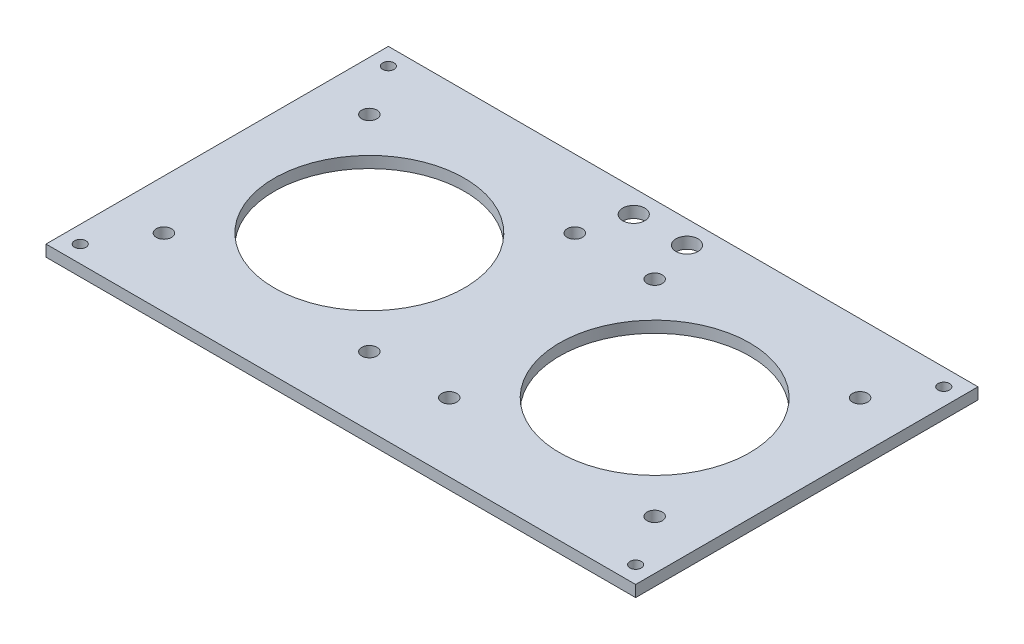
ISO-10303-21;
HEADER;
FILE_DESCRIPTION(('STEP AP214'),'2;1');
FILE_NAME('part.step','',(''),(''),'','','');
FILE_SCHEMA(('AUTOMOTIVE_DESIGN { 1 0 10303 214 1 1 1 1 }'));
ENDSEC;
DATA;
#1=APPLICATION_CONTEXT('core data for automotive mechanical design processes');
#2=APPLICATION_PROTOCOL_DEFINITION('international standard','automotive_design',2000,#1);
#3=PRODUCT_CONTEXT('',#1,'mechanical');
#4=PRODUCT('Part','Part','',(#3));
#5=PRODUCT_RELATED_PRODUCT_CATEGORY('part','',(#4));
#6=PRODUCT_DEFINITION_FORMATION('','',#4);
#7=PRODUCT_DEFINITION_CONTEXT('part definition',#1,'design');
#8=PRODUCT_DEFINITION('design','',#6,#7);
#9=PRODUCT_DEFINITION_SHAPE('','',#8);
#10=(LENGTH_UNIT() NAMED_UNIT(*) SI_UNIT(.MILLI.,.METRE.));
#11=(NAMED_UNIT(*) PLANE_ANGLE_UNIT() SI_UNIT($,.RADIAN.));
#12=(NAMED_UNIT(*) SI_UNIT($,.STERADIAN.) SOLID_ANGLE_UNIT());
#13=UNCERTAINTY_MEASURE_WITH_UNIT(LENGTH_MEASURE(1.E-05),#10,'distance_accuracy_value','');
#14=(GEOMETRIC_REPRESENTATION_CONTEXT(3) GLOBAL_UNCERTAINTY_ASSIGNED_CONTEXT((#13)) GLOBAL_UNIT_ASSIGNED_CONTEXT((#10,
#11,#12)) REPRESENTATION_CONTEXT('',''));
#15=CARTESIAN_POINT('',(0.,0.,0.));
#16=DIRECTION('',(0.,0.,1.));
#17=DIRECTION('',(1.,0.,0.));
#18=AXIS2_PLACEMENT_3D('',#15,#16,#17);
#19=CARTESIAN_POINT('',(0.,3.,0.));
#20=DIRECTION('',(0.,-1.,0.));
#21=DIRECTION('',(0.,0.,-1.));
#22=AXIS2_PLACEMENT_3D('',#19,#20,#21);
#23=PLANE('',#22);
#24=DIRECTION('',(0.,0.,-1.));
#25=VECTOR('',#24,1.);
#26=CARTESIAN_POINT('',(77.5,3.,45.));
#27=LINE('',#26,#25);
#28=CARTESIAN_POINT('',(77.5,3.,45.));
#29=VERTEX_POINT('',#28);
#30=CARTESIAN_POINT('',(77.5,3.,-45.));
#31=VERTEX_POINT('',#30);
#32=EDGE_CURVE('E91',#29,#31,#27,.T.);
#33=ORIENTED_EDGE('',*,*,#32,.T.);
#34=DIRECTION('',(-1.,0.,0.));
#35=VECTOR('',#34,1.);
#36=CARTESIAN_POINT('',(-77.5,3.,-45.));
#37=LINE('',#36,#35);
#38=CARTESIAN_POINT('',(-77.5,3.,-45.));
#39=VERTEX_POINT('',#38);
#40=EDGE_CURVE('E86',#31,#39,#37,.T.);
#41=ORIENTED_EDGE('',*,*,#40,.T.);
#42=DIRECTION('',(0.,0.,1.));
#43=VECTOR('',#42,1.);
#44=CARTESIAN_POINT('',(-77.5,3.,45.));
#45=LINE('',#44,#43);
#46=CARTESIAN_POINT('',(-77.5,3.,45.));
#47=VERTEX_POINT('',#46);
#48=EDGE_CURVE('E89',#39,#47,#45,.T.);
#49=ORIENTED_EDGE('',*,*,#48,.T.);
#50=DIRECTION('',(1.,0.,0.));
#51=VECTOR('',#50,1.);
#52=CARTESIAN_POINT('',(-77.5,3.,45.));
#53=LINE('',#52,#51);
#54=EDGE_CURVE('E56',#47,#29,#53,.T.);
#55=ORIENTED_EDGE('',*,*,#54,.T.);
#56=EDGE_LOOP('',(#33,#41,#49,#55));
#57=FACE_BOUND('',#56,.T.);
#58=CARTESIAN_POINT('',(-37.5,3.,0.));
#59=DIRECTION('',(0.,1.,0.));
#60=DIRECTION('',(0.,0.,1.));
#61=AXIS2_PLACEMENT_3D('',#58,#59,#60);
#62=CIRCLE('',#61,25.);
#63=CARTESIAN_POINT('',(-37.5,3.,25.));
#64=VERTEX_POINT('',#63);
#65=EDGE_CURVE('E106',#64,#64,#62,.T.);
#66=ORIENTED_EDGE('',*,*,#65,.F.);
#67=EDGE_LOOP('',(#66));
#68=FACE_BOUND('',#67,.T.);
#69=CARTESIAN_POINT('',(-64.5,3.,-27.));
#70=DIRECTION('',(0.,1.,0.));
#71=DIRECTION('',(0.,0.,1.));
#72=AXIS2_PLACEMENT_3D('',#69,#70,#71);
#73=CIRCLE('',#72,2.);
#74=CARTESIAN_POINT('',(-64.5,3.,-25.));
#75=VERTEX_POINT('',#74);
#76=EDGE_CURVE('E121',#75,#75,#73,.T.);
#77=ORIENTED_EDGE('',*,*,#76,.F.);
#78=EDGE_LOOP('',(#77));
#79=FACE_BOUND('',#78,.T.);
#80=CARTESIAN_POINT('',(-10.5,3.,-27.));
#81=DIRECTION('',(0.,1.,0.));
#82=DIRECTION('',(0.,0.,-1.));
#83=AXIS2_PLACEMENT_3D('',#80,#81,#82);
#84=CIRCLE('',#83,2.);
#85=CARTESIAN_POINT('',(-10.5,3.,-29.));
#86=VERTEX_POINT('',#85);
#87=EDGE_CURVE('E127',#86,#86,#84,.T.);
#88=ORIENTED_EDGE('',*,*,#87,.F.);
#89=EDGE_LOOP('',(#88));
#90=FACE_BOUND('',#89,.T.);
#91=CARTESIAN_POINT('',(10.5000000000001,3.,27.));
#92=DIRECTION('',(0.,1.,0.));
#93=DIRECTION('',(0.,0.,-1.));
#94=AXIS2_PLACEMENT_3D('',#91,#92,#93);
#95=CIRCLE('',#94,2.);
#96=CARTESIAN_POINT('',(10.5000000000001,3.,25.));
#97=VERTEX_POINT('',#96);
#98=EDGE_CURVE('E133',#97,#97,#95,.T.);
#99=ORIENTED_EDGE('',*,*,#98,.F.);
#100=EDGE_LOOP('',(#99));
#101=FACE_BOUND('',#100,.T.);
#102=CARTESIAN_POINT('',(-10.5,3.,27.));
#103=DIRECTION('',(0.,1.,0.));
#104=DIRECTION('',(0.,0.,1.));
#105=AXIS2_PLACEMENT_3D('',#102,#103,#104);
#106=CIRCLE('',#105,2.);
#107=CARTESIAN_POINT('',(-10.5,3.,29.));
#108=VERTEX_POINT('',#107);
#109=EDGE_CURVE('E139',#108,#108,#106,.T.);
#110=ORIENTED_EDGE('',*,*,#109,.F.);
#111=EDGE_LOOP('',(#110));
#112=FACE_BOUND('',#111,.T.);
#113=CARTESIAN_POINT('',(-64.5,3.,27.));
#114=DIRECTION('',(0.,1.,0.));
#115=DIRECTION('',(0.,0.,-1.));
#116=AXIS2_PLACEMENT_3D('',#113,#114,#115);
#117=CIRCLE('',#116,2.);
#118=CARTESIAN_POINT('',(-64.5,3.,25.));
#119=VERTEX_POINT('',#118);
#120=EDGE_CURVE('E145',#119,#119,#117,.T.);
#121=ORIENTED_EDGE('',*,*,#120,.F.);
#122=EDGE_LOOP('',(#121));
#123=FACE_BOUND('',#122,.T.);
#124=CARTESIAN_POINT('',(64.5000000000001,3.,27.));
#125=DIRECTION('',(0.,1.,0.));
#126=DIRECTION('',(0.,0.,1.));
#127=AXIS2_PLACEMENT_3D('',#124,#125,#126);
#128=CIRCLE('',#127,2.);
#129=CARTESIAN_POINT('',(64.5000000000001,3.,29.));
#130=VERTEX_POINT('',#129);
#131=EDGE_CURVE('E151',#130,#130,#128,.T.);
#132=ORIENTED_EDGE('',*,*,#131,.F.);
#133=EDGE_LOOP('',(#132));
#134=FACE_BOUND('',#133,.T.);
#135=CARTESIAN_POINT('',(64.5000000000001,3.,-27.));
#136=DIRECTION('',(0.,1.,0.));
#137=DIRECTION('',(0.,0.,-1.));
#138=AXIS2_PLACEMENT_3D('',#135,#136,#137);
#139=CIRCLE('',#138,2.);
#140=CARTESIAN_POINT('',(64.5000000000001,3.,-29.));
#141=VERTEX_POINT('',#140);
#142=EDGE_CURVE('E157',#141,#141,#139,.T.);
#143=ORIENTED_EDGE('',*,*,#142,.F.);
#144=EDGE_LOOP('',(#143));
#145=FACE_BOUND('',#144,.T.);
#146=CARTESIAN_POINT('',(10.5000000000001,3.,-27.));
#147=DIRECTION('',(0.,1.,0.));
#148=DIRECTION('',(0.,0.,1.));
#149=AXIS2_PLACEMENT_3D('',#146,#147,#148);
#150=CIRCLE('',#149,2.);
#151=CARTESIAN_POINT('',(10.5000000000001,3.,-25.));
#152=VERTEX_POINT('',#151);
#153=EDGE_CURVE('E163',#152,#152,#150,.T.);
#154=ORIENTED_EDGE('',*,*,#153,.F.);
#155=EDGE_LOOP('',(#154));
#156=FACE_BOUND('',#155,.T.);
#157=CARTESIAN_POINT('',(37.5000000000001,3.,0.));
#158=DIRECTION('',(0.,1.,0.));
#159=DIRECTION('',(0.,0.,-1.));
#160=AXIS2_PLACEMENT_3D('',#157,#158,#159);
#161=CIRCLE('',#160,25.);
#162=CARTESIAN_POINT('',(37.5000000000001,3.,-25.));
#163=VERTEX_POINT('',#162);
#164=EDGE_CURVE('E169',#163,#163,#161,.T.);
#165=ORIENTED_EDGE('',*,*,#164,.F.);
#166=EDGE_LOOP('',(#165));
#167=FACE_BOUND('',#166,.T.);
#168=CARTESIAN_POINT('',(-73.,3.,-40.5));
#169=DIRECTION('',(0.,1.,0.));
#170=DIRECTION('',(0.,0.,1.));
#171=AXIS2_PLACEMENT_3D('',#168,#169,#170);
#172=CIRCLE('',#171,1.5);
#173=CARTESIAN_POINT('',(-73.,3.,-39.));
#174=VERTEX_POINT('',#173);
#175=EDGE_CURVE('E175',#174,#174,#172,.T.);
#176=ORIENTED_EDGE('',*,*,#175,.F.);
#177=EDGE_LOOP('',(#176));
#178=FACE_BOUND('',#177,.T.);
#179=CARTESIAN_POINT('',(73.,3.,-40.5));
#180=DIRECTION('',(0.,1.,0.));
#181=DIRECTION('',(0.,0.,-1.));
#182=AXIS2_PLACEMENT_3D('',#179,#180,#181);
#183=CIRCLE('',#182,1.5);
#184=CARTESIAN_POINT('',(73.,3.,-42.));
#185=VERTEX_POINT('',#184);
#186=EDGE_CURVE('E181',#185,#185,#183,.T.);
#187=ORIENTED_EDGE('',*,*,#186,.F.);
#188=EDGE_LOOP('',(#187));
#189=FACE_BOUND('',#188,.T.);
#190=CARTESIAN_POINT('',(73.,3.,40.5));
#191=DIRECTION('',(0.,1.,0.));
#192=DIRECTION('',(0.,0.,1.));
#193=AXIS2_PLACEMENT_3D('',#190,#191,#192);
#194=CIRCLE('',#193,1.5);
#195=CARTESIAN_POINT('',(73.,3.,42.));
#196=VERTEX_POINT('',#195);
#197=EDGE_CURVE('E187',#196,#196,#194,.T.);
#198=ORIENTED_EDGE('',*,*,#197,.F.);
#199=EDGE_LOOP('',(#198));
#200=FACE_BOUND('',#199,.T.);
#201=CARTESIAN_POINT('',(-73.,3.,40.5));
#202=DIRECTION('',(0.,1.,0.));
#203=DIRECTION('',(0.,0.,-1.));
#204=AXIS2_PLACEMENT_3D('',#201,#202,#203);
#205=CIRCLE('',#204,1.5);
#206=CARTESIAN_POINT('',(-73.,3.,39.));
#207=VERTEX_POINT('',#206);
#208=EDGE_CURVE('E193',#207,#207,#205,.T.);
#209=ORIENTED_EDGE('',*,*,#208,.F.);
#210=EDGE_LOOP('',(#209));
#211=FACE_BOUND('',#210,.T.);
#212=CARTESIAN_POINT('',(-7.,3.,-39.));
#213=DIRECTION('',(0.,1.,0.));
#214=DIRECTION('',(0.,0.,1.));
#215=AXIS2_PLACEMENT_3D('',#212,#213,#214);
#216=CIRCLE('',#215,2.9);
#217=CARTESIAN_POINT('',(-7.,3.,-36.1));
#218=VERTEX_POINT('',#217);
#219=EDGE_CURVE('E199',#218,#218,#216,.T.);
#220=ORIENTED_EDGE('',*,*,#219,.F.);
#221=EDGE_LOOP('',(#220));
#222=FACE_BOUND('',#221,.T.);
#223=CARTESIAN_POINT('',(7.00000000000008,3.,-39.));
#224=DIRECTION('',(0.,1.,0.));
#225=DIRECTION('',(0.,0.,-1.));
#226=AXIS2_PLACEMENT_3D('',#223,#224,#225);
#227=CIRCLE('',#226,2.9);
#228=CARTESIAN_POINT('',(7.00000000000008,3.,-41.9));
#229=VERTEX_POINT('',#228);
#230=EDGE_CURVE('E205',#229,#229,#227,.T.);
#231=ORIENTED_EDGE('',*,*,#230,.F.);
#232=EDGE_LOOP('',(#231));
#233=FACE_BOUND('',#232,.T.);
#234=ADVANCED_FACE('F39',(#57,#68,#79,#90,#101,#112,#123,#134,#145,#156,#167,#178,#189,#200,
#211,#222,#233),#23,.F.);
#235=CARTESIAN_POINT('',(0.,0.,0.));
#236=DIRECTION('',(0.,-1.,0.));
#237=DIRECTION('',(0.,0.,-1.));
#238=AXIS2_PLACEMENT_3D('',#235,#236,#237);
#239=PLANE('',#238);
#240=CARTESIAN_POINT('',(-7.,0.,-39.));
#241=DIRECTION('',(0.,1.,0.));
#242=DIRECTION('',(0.,0.,1.));
#243=AXIS2_PLACEMENT_3D('',#240,#241,#242);
#244=CIRCLE('',#243,2.9);
#245=CARTESIAN_POINT('',(-7.,0.,-36.1));
#246=VERTEX_POINT('',#245);
#247=EDGE_CURVE('E202',#246,#246,#244,.T.);
#248=ORIENTED_EDGE('',*,*,#247,.T.);
#249=EDGE_LOOP('',(#248));
#250=FACE_BOUND('',#249,.T.);
#251=CARTESIAN_POINT('',(73.,0.,40.5));
#252=DIRECTION('',(0.,1.,0.));
#253=DIRECTION('',(0.,0.,1.));
#254=AXIS2_PLACEMENT_3D('',#251,#252,#253);
#255=CIRCLE('',#254,1.5);
#256=CARTESIAN_POINT('',(73.,0.,42.));
#257=VERTEX_POINT('',#256);
#258=EDGE_CURVE('E190',#257,#257,#255,.T.);
#259=ORIENTED_EDGE('',*,*,#258,.T.);
#260=EDGE_LOOP('',(#259));
#261=FACE_BOUND('',#260,.T.);
#262=CARTESIAN_POINT('',(-73.,0.,-40.5));
#263=DIRECTION('',(0.,1.,0.));
#264=DIRECTION('',(0.,0.,1.));
#265=AXIS2_PLACEMENT_3D('',#262,#263,#264);
#266=CIRCLE('',#265,1.5);
#267=CARTESIAN_POINT('',(-73.,0.,-39.));
#268=VERTEX_POINT('',#267);
#269=EDGE_CURVE('E178',#268,#268,#266,.T.);
#270=ORIENTED_EDGE('',*,*,#269,.T.);
#271=EDGE_LOOP('',(#270));
#272=FACE_BOUND('',#271,.T.);
#273=CARTESIAN_POINT('',(10.5000000000001,0.,-27.));
#274=DIRECTION('',(0.,1.,0.));
#275=DIRECTION('',(0.,0.,1.));
#276=AXIS2_PLACEMENT_3D('',#273,#274,#275);
#277=CIRCLE('',#276,2.);
#278=CARTESIAN_POINT('',(10.5000000000001,0.,-25.));
#279=VERTEX_POINT('',#278);
#280=EDGE_CURVE('E166',#279,#279,#277,.T.);
#281=ORIENTED_EDGE('',*,*,#280,.T.);
#282=EDGE_LOOP('',(#281));
#283=FACE_BOUND('',#282,.T.);
#284=CARTESIAN_POINT('',(64.5000000000001,0.,27.));
#285=DIRECTION('',(0.,1.,0.));
#286=DIRECTION('',(0.,0.,1.));
#287=AXIS2_PLACEMENT_3D('',#284,#285,#286);
#288=CIRCLE('',#287,2.);
#289=CARTESIAN_POINT('',(64.5000000000001,0.,29.));
#290=VERTEX_POINT('',#289);
#291=EDGE_CURVE('E154',#290,#290,#288,.T.);
#292=ORIENTED_EDGE('',*,*,#291,.T.);
#293=EDGE_LOOP('',(#292));
#294=FACE_BOUND('',#293,.T.);
#295=CARTESIAN_POINT('',(-10.5,0.,27.));
#296=DIRECTION('',(0.,1.,0.));
#297=DIRECTION('',(0.,0.,1.));
#298=AXIS2_PLACEMENT_3D('',#295,#296,#297);
#299=CIRCLE('',#298,2.);
#300=CARTESIAN_POINT('',(-10.5,0.,29.));
#301=VERTEX_POINT('',#300);
#302=EDGE_CURVE('E142',#301,#301,#299,.T.);
#303=ORIENTED_EDGE('',*,*,#302,.T.);
#304=EDGE_LOOP('',(#303));
#305=FACE_BOUND('',#304,.T.);
#306=CARTESIAN_POINT('',(-10.5,0.,-27.));
#307=DIRECTION('',(0.,1.,0.));
#308=DIRECTION('',(0.,0.,-1.));
#309=AXIS2_PLACEMENT_3D('',#306,#307,#308);
#310=CIRCLE('',#309,2.);
#311=CARTESIAN_POINT('',(-10.5,0.,-29.));
#312=VERTEX_POINT('',#311);
#313=EDGE_CURVE('E130',#312,#312,#310,.T.);
#314=ORIENTED_EDGE('',*,*,#313,.T.);
#315=EDGE_LOOP('',(#314));
#316=FACE_BOUND('',#315,.T.);
#317=CARTESIAN_POINT('',(-37.5,0.,0.));
#318=DIRECTION('',(0.,1.,0.));
#319=DIRECTION('',(0.,0.,1.));
#320=AXIS2_PLACEMENT_3D('',#317,#318,#319);
#321=CIRCLE('',#320,25.);
#322=CARTESIAN_POINT('',(-37.5,0.,25.));
#323=VERTEX_POINT('',#322);
#324=EDGE_CURVE('E118',#323,#323,#321,.T.);
#325=ORIENTED_EDGE('',*,*,#324,.T.);
#326=EDGE_LOOP('',(#325));
#327=FACE_BOUND('',#326,.T.);
#328=DIRECTION('',(0.,0.,-1.));
#329=VECTOR('',#328,1.);
#330=CARTESIAN_POINT('',(77.5,0.,45.));
#331=LINE('',#330,#329);
#332=CARTESIAN_POINT('',(77.5,0.,45.));
#333=VERTEX_POINT('',#332);
#334=CARTESIAN_POINT('',(77.5,0.,-45.));
#335=VERTEX_POINT('',#334);
#336=EDGE_CURVE('E103',#333,#335,#331,.T.);
#337=ORIENTED_EDGE('',*,*,#336,.F.);
#338=DIRECTION('',(1.,0.,0.));
#339=VECTOR('',#338,1.);
#340=CARTESIAN_POINT('',(-77.5,0.,45.));
#341=LINE('',#340,#339);
#342=CARTESIAN_POINT('',(-77.5,0.,45.));
#343=VERTEX_POINT('',#342);
#344=EDGE_CURVE('E79',#343,#333,#341,.T.);
#345=ORIENTED_EDGE('',*,*,#344,.F.);
#346=DIRECTION('',(0.,0.,1.));
#347=VECTOR('',#346,1.);
#348=CARTESIAN_POINT('',(-77.5,0.,45.));
#349=LINE('',#348,#347);
#350=CARTESIAN_POINT('',(-77.5,0.,-45.));
#351=VERTEX_POINT('',#350);
#352=EDGE_CURVE('E73',#351,#343,#349,.T.);
#353=ORIENTED_EDGE('',*,*,#352,.F.);
#354=DIRECTION('',(-1.,0.,0.));
#355=VECTOR('',#354,1.);
#356=CARTESIAN_POINT('',(-77.5,0.,-45.));
#357=LINE('',#356,#355);
#358=EDGE_CURVE('E95',#335,#351,#357,.T.);
#359=ORIENTED_EDGE('',*,*,#358,.F.);
#360=EDGE_LOOP('',(#337,#345,#353,#359));
#361=FACE_BOUND('',#360,.T.);
#362=CARTESIAN_POINT('',(-64.5,0.,-27.));
#363=DIRECTION('',(0.,1.,0.));
#364=DIRECTION('',(0.,0.,1.));
#365=AXIS2_PLACEMENT_3D('',#362,#363,#364);
#366=CIRCLE('',#365,2.);
#367=CARTESIAN_POINT('',(-64.5,0.,-25.));
#368=VERTEX_POINT('',#367);
#369=EDGE_CURVE('E124',#368,#368,#366,.T.);
#370=ORIENTED_EDGE('',*,*,#369,.T.);
#371=EDGE_LOOP('',(#370));
#372=FACE_BOUND('',#371,.T.);
#373=CARTESIAN_POINT('',(10.5000000000001,0.,27.));
#374=DIRECTION('',(0.,1.,0.));
#375=DIRECTION('',(0.,0.,-1.));
#376=AXIS2_PLACEMENT_3D('',#373,#374,#375);
#377=CIRCLE('',#376,2.);
#378=CARTESIAN_POINT('',(10.5000000000001,0.,25.));
#379=VERTEX_POINT('',#378);
#380=EDGE_CURVE('E136',#379,#379,#377,.T.);
#381=ORIENTED_EDGE('',*,*,#380,.T.);
#382=EDGE_LOOP('',(#381));
#383=FACE_BOUND('',#382,.T.);
#384=CARTESIAN_POINT('',(-64.5,0.,27.));
#385=DIRECTION('',(0.,1.,0.));
#386=DIRECTION('',(0.,0.,-1.));
#387=AXIS2_PLACEMENT_3D('',#384,#385,#386);
#388=CIRCLE('',#387,2.);
#389=CARTESIAN_POINT('',(-64.5,0.,25.));
#390=VERTEX_POINT('',#389);
#391=EDGE_CURVE('E148',#390,#390,#388,.T.);
#392=ORIENTED_EDGE('',*,*,#391,.T.);
#393=EDGE_LOOP('',(#392));
#394=FACE_BOUND('',#393,.T.);
#395=CARTESIAN_POINT('',(64.5000000000001,0.,-27.));
#396=DIRECTION('',(0.,1.,0.));
#397=DIRECTION('',(0.,0.,-1.));
#398=AXIS2_PLACEMENT_3D('',#395,#396,#397);
#399=CIRCLE('',#398,2.);
#400=CARTESIAN_POINT('',(64.5000000000001,0.,-29.));
#401=VERTEX_POINT('',#400);
#402=EDGE_CURVE('E160',#401,#401,#399,.T.);
#403=ORIENTED_EDGE('',*,*,#402,.T.);
#404=EDGE_LOOP('',(#403));
#405=FACE_BOUND('',#404,.T.);
#406=CARTESIAN_POINT('',(37.5000000000001,0.,0.));
#407=DIRECTION('',(0.,1.,0.));
#408=DIRECTION('',(0.,0.,-1.));
#409=AXIS2_PLACEMENT_3D('',#406,#407,#408);
#410=CIRCLE('',#409,25.);
#411=CARTESIAN_POINT('',(37.5000000000001,0.,-25.));
#412=VERTEX_POINT('',#411);
#413=EDGE_CURVE('E172',#412,#412,#410,.T.);
#414=ORIENTED_EDGE('',*,*,#413,.T.);
#415=EDGE_LOOP('',(#414));
#416=FACE_BOUND('',#415,.T.);
#417=CARTESIAN_POINT('',(73.,0.,-40.5));
#418=DIRECTION('',(0.,1.,0.));
#419=DIRECTION('',(0.,0.,-1.));
#420=AXIS2_PLACEMENT_3D('',#417,#418,#419);
#421=CIRCLE('',#420,1.5);
#422=CARTESIAN_POINT('',(73.,0.,-42.));
#423=VERTEX_POINT('',#422);
#424=EDGE_CURVE('E184',#423,#423,#421,.T.);
#425=ORIENTED_EDGE('',*,*,#424,.T.);
#426=EDGE_LOOP('',(#425));
#427=FACE_BOUND('',#426,.T.);
#428=CARTESIAN_POINT('',(-73.,0.,40.5));
#429=DIRECTION('',(0.,1.,0.));
#430=DIRECTION('',(0.,0.,-1.));
#431=AXIS2_PLACEMENT_3D('',#428,#429,#430);
#432=CIRCLE('',#431,1.5);
#433=CARTESIAN_POINT('',(-73.,0.,39.));
#434=VERTEX_POINT('',#433);
#435=EDGE_CURVE('E196',#434,#434,#432,.T.);
#436=ORIENTED_EDGE('',*,*,#435,.T.);
#437=EDGE_LOOP('',(#436));
#438=FACE_BOUND('',#437,.T.);
#439=CARTESIAN_POINT('',(7.00000000000008,0.,-39.));
#440=DIRECTION('',(0.,1.,0.));
#441=DIRECTION('',(0.,0.,-1.));
#442=AXIS2_PLACEMENT_3D('',#439,#440,#441);
#443=CIRCLE('',#442,2.9);
#444=CARTESIAN_POINT('',(7.00000000000008,0.,-41.9));
#445=VERTEX_POINT('',#444);
#446=EDGE_CURVE('E208',#445,#445,#443,.T.);
#447=ORIENTED_EDGE('',*,*,#446,.T.);
#448=EDGE_LOOP('',(#447));
#449=FACE_BOUND('',#448,.T.);
#450=ADVANCED_FACE('F114',(#250,#261,#272,#283,#294,#305,#316,#327,#361,#372,#383,#394,#405,
#416,#427,#438,#449),#239,.T.);
#451=CARTESIAN_POINT('',(77.5,3.,45.));
#452=DIRECTION('',(-1.,0.,0.));
#453=DIRECTION('',(0.,0.,1.));
#454=AXIS2_PLACEMENT_3D('',#451,#452,#453);
#455=PLANE('',#454);
#456=ORIENTED_EDGE('',*,*,#336,.T.);
#457=DIRECTION('',(0.,-1.,0.));
#458=VECTOR('',#457,1.);
#459=CARTESIAN_POINT('',(77.5,3.,-45.));
#460=LINE('',#459,#458);
#461=EDGE_CURVE('E11',#31,#335,#460,.T.);
#462=ORIENTED_EDGE('',*,*,#461,.F.);
#463=ORIENTED_EDGE('',*,*,#32,.F.);
#464=DIRECTION('',(0.,-1.,0.));
#465=VECTOR('',#464,1.);
#466=CARTESIAN_POINT('',(77.5,3.,45.));
#467=LINE('',#466,#465);
#468=EDGE_CURVE('E99',#29,#333,#467,.T.);
#469=ORIENTED_EDGE('',*,*,#468,.T.);
#470=EDGE_LOOP('',(#456,#462,#463,#469));
#471=FACE_BOUND('',#470,.T.);
#472=ADVANCED_FACE('F41',(#471),#455,.F.);
#473=CARTESIAN_POINT('',(-77.5,3.,-45.));
#474=DIRECTION('',(0.,0.,1.));
#475=DIRECTION('',(1.,0.,0.));
#476=AXIS2_PLACEMENT_3D('',#473,#474,#475);
#477=PLANE('',#476);
#478=ORIENTED_EDGE('',*,*,#358,.T.);
#479=DIRECTION('',(0.,-1.,0.));
#480=VECTOR('',#479,1.);
#481=CARTESIAN_POINT('',(-77.5,3.,-45.));
#482=LINE('',#481,#480);
#483=EDGE_CURVE('E48',#39,#351,#482,.T.);
#484=ORIENTED_EDGE('',*,*,#483,.F.);
#485=ORIENTED_EDGE('',*,*,#40,.F.);
#486=ORIENTED_EDGE('',*,*,#461,.T.);
#487=EDGE_LOOP('',(#478,#484,#485,#486));
#488=FACE_BOUND('',#487,.T.);
#489=ADVANCED_FACE('F94',(#488),#477,.F.);
#490=CARTESIAN_POINT('',(-77.5,3.,45.));
#491=DIRECTION('',(1.,0.,0.));
#492=DIRECTION('',(0.,0.,-1.));
#493=AXIS2_PLACEMENT_3D('',#490,#491,#492);
#494=PLANE('',#493);
#495=ORIENTED_EDGE('',*,*,#352,.T.);
#496=DIRECTION('',(0.,-1.,0.));
#497=VECTOR('',#496,1.);
#498=CARTESIAN_POINT('',(-77.5,3.,45.));
#499=LINE('',#498,#497);
#500=EDGE_CURVE('E96',#47,#343,#499,.T.);
#501=ORIENTED_EDGE('',*,*,#500,.F.);
#502=ORIENTED_EDGE('',*,*,#48,.F.);
#503=ORIENTED_EDGE('',*,*,#483,.T.);
#504=EDGE_LOOP('',(#495,#501,#502,#503));
#505=FACE_BOUND('',#504,.T.);
#506=ADVANCED_FACE('F97',(#505),#494,.F.);
#507=CARTESIAN_POINT('',(-77.5,3.,45.));
#508=DIRECTION('',(0.,0.,-1.));
#509=DIRECTION('',(-1.,0.,0.));
#510=AXIS2_PLACEMENT_3D('',#507,#508,#509);
#511=PLANE('',#510);
#512=ORIENTED_EDGE('',*,*,#344,.T.);
#513=ORIENTED_EDGE('',*,*,#468,.F.);
#514=ORIENTED_EDGE('',*,*,#54,.F.);
#515=ORIENTED_EDGE('',*,*,#500,.T.);
#516=EDGE_LOOP('',(#512,#513,#514,#515));
#517=FACE_BOUND('',#516,.T.);
#518=ADVANCED_FACE('F111',(#517),#511,.F.);
#519=CARTESIAN_POINT('',(-37.5,3.,0.));
#520=DIRECTION('',(0.,-1.,0.));
#521=DIRECTION('',(0.,0.,-1.));
#522=AXIS2_PLACEMENT_3D('',#519,#520,#521);
#523=CYLINDRICAL_SURFACE('',#522,25.);
#524=ORIENTED_EDGE('',*,*,#65,.T.);
#525=EDGE_LOOP('',(#524));
#526=FACE_BOUND('',#525,.T.);
#527=ORIENTED_EDGE('',*,*,#324,.F.);
#528=EDGE_LOOP('',(#527));
#529=FACE_BOUND('',#528,.T.);
#530=ADVANCED_FACE('F225',(#526,#529),#523,.F.);
#531=CARTESIAN_POINT('',(-64.5,3.,-27.));
#532=DIRECTION('',(0.,-1.,0.));
#533=DIRECTION('',(0.,0.,-1.));
#534=AXIS2_PLACEMENT_3D('',#531,#532,#533);
#535=CYLINDRICAL_SURFACE('',#534,2.);
#536=ORIENTED_EDGE('',*,*,#76,.T.);
#537=EDGE_LOOP('',(#536));
#538=FACE_BOUND('',#537,.T.);
#539=ORIENTED_EDGE('',*,*,#369,.F.);
#540=EDGE_LOOP('',(#539));
#541=FACE_BOUND('',#540,.T.);
#542=ADVANCED_FACE('F270',(#538,#541),#535,.F.);
#543=CARTESIAN_POINT('',(-10.5,3.,-27.));
#544=DIRECTION('',(0.,-1.,0.));
#545=DIRECTION('',(0.,0.,-1.));
#546=AXIS2_PLACEMENT_3D('',#543,#544,#545);
#547=CYLINDRICAL_SURFACE('',#546,2.);
#548=ORIENTED_EDGE('',*,*,#87,.T.);
#549=EDGE_LOOP('',(#548));
#550=FACE_BOUND('',#549,.T.);
#551=ORIENTED_EDGE('',*,*,#313,.F.);
#552=EDGE_LOOP('',(#551));
#553=FACE_BOUND('',#552,.T.);
#554=ADVANCED_FACE('F278',(#550,#553),#547,.F.);
#555=CARTESIAN_POINT('',(10.5000000000001,3.,27.));
#556=DIRECTION('',(0.,-1.,0.));
#557=DIRECTION('',(0.,0.,-1.));
#558=AXIS2_PLACEMENT_3D('',#555,#556,#557);
#559=CYLINDRICAL_SURFACE('',#558,2.);
#560=ORIENTED_EDGE('',*,*,#98,.T.);
#561=EDGE_LOOP('',(#560));
#562=FACE_BOUND('',#561,.T.);
#563=ORIENTED_EDGE('',*,*,#380,.F.);
#564=EDGE_LOOP('',(#563));
#565=FACE_BOUND('',#564,.T.);
#566=ADVANCED_FACE('F286',(#562,#565),#559,.F.);
#567=CARTESIAN_POINT('',(-10.5,3.,27.));
#568=DIRECTION('',(0.,-1.,0.));
#569=DIRECTION('',(0.,0.,-1.));
#570=AXIS2_PLACEMENT_3D('',#567,#568,#569);
#571=CYLINDRICAL_SURFACE('',#570,2.);
#572=ORIENTED_EDGE('',*,*,#109,.T.);
#573=EDGE_LOOP('',(#572));
#574=FACE_BOUND('',#573,.T.);
#575=ORIENTED_EDGE('',*,*,#302,.F.);
#576=EDGE_LOOP('',(#575));
#577=FACE_BOUND('',#576,.T.);
#578=ADVANCED_FACE('F295',(#574,#577),#571,.F.);
#579=CARTESIAN_POINT('',(-64.5,3.,27.));
#580=DIRECTION('',(0.,-1.,0.));
#581=DIRECTION('',(0.,0.,-1.));
#582=AXIS2_PLACEMENT_3D('',#579,#580,#581);
#583=CYLINDRICAL_SURFACE('',#582,2.);
#584=ORIENTED_EDGE('',*,*,#120,.T.);
#585=EDGE_LOOP('',(#584));
#586=FACE_BOUND('',#585,.T.);
#587=ORIENTED_EDGE('',*,*,#391,.F.);
#588=EDGE_LOOP('',(#587));
#589=FACE_BOUND('',#588,.T.);
#590=ADVANCED_FACE('F304',(#586,#589),#583,.F.);
#591=CARTESIAN_POINT('',(64.5000000000001,3.,27.));
#592=DIRECTION('',(0.,-1.,0.));
#593=DIRECTION('',(0.,0.,-1.));
#594=AXIS2_PLACEMENT_3D('',#591,#592,#593);
#595=CYLINDRICAL_SURFACE('',#594,2.);
#596=ORIENTED_EDGE('',*,*,#131,.T.);
#597=EDGE_LOOP('',(#596));
#598=FACE_BOUND('',#597,.T.);
#599=ORIENTED_EDGE('',*,*,#291,.F.);
#600=EDGE_LOOP('',(#599));
#601=FACE_BOUND('',#600,.T.);
#602=ADVANCED_FACE('F313',(#598,#601),#595,.F.);
#603=CARTESIAN_POINT('',(64.5000000000001,3.,-27.));
#604=DIRECTION('',(0.,-1.,0.));
#605=DIRECTION('',(0.,0.,-1.));
#606=AXIS2_PLACEMENT_3D('',#603,#604,#605);
#607=CYLINDRICAL_SURFACE('',#606,2.);
#608=ORIENTED_EDGE('',*,*,#142,.T.);
#609=EDGE_LOOP('',(#608));
#610=FACE_BOUND('',#609,.T.);
#611=ORIENTED_EDGE('',*,*,#402,.F.);
#612=EDGE_LOOP('',(#611));
#613=FACE_BOUND('',#612,.T.);
#614=ADVANCED_FACE('F322',(#610,#613),#607,.F.);
#615=CARTESIAN_POINT('',(10.5000000000001,3.,-27.));
#616=DIRECTION('',(0.,-1.,0.));
#617=DIRECTION('',(0.,0.,-1.));
#618=AXIS2_PLACEMENT_3D('',#615,#616,#617);
#619=CYLINDRICAL_SURFACE('',#618,2.);
#620=ORIENTED_EDGE('',*,*,#153,.T.);
#621=EDGE_LOOP('',(#620));
#622=FACE_BOUND('',#621,.T.);
#623=ORIENTED_EDGE('',*,*,#280,.F.);
#624=EDGE_LOOP('',(#623));
#625=FACE_BOUND('',#624,.T.);
#626=ADVANCED_FACE('F331',(#622,#625),#619,.F.);
#627=CARTESIAN_POINT('',(37.5000000000001,3.,0.));
#628=DIRECTION('',(0.,-1.,0.));
#629=DIRECTION('',(0.,0.,-1.));
#630=AXIS2_PLACEMENT_3D('',#627,#628,#629);
#631=CYLINDRICAL_SURFACE('',#630,25.);
#632=ORIENTED_EDGE('',*,*,#164,.T.);
#633=EDGE_LOOP('',(#632));
#634=FACE_BOUND('',#633,.T.);
#635=ORIENTED_EDGE('',*,*,#413,.F.);
#636=EDGE_LOOP('',(#635));
#637=FACE_BOUND('',#636,.T.);
#638=ADVANCED_FACE('F340',(#634,#637),#631,.F.);
#639=CARTESIAN_POINT('',(-73.,3.,-40.5));
#640=DIRECTION('',(0.,-1.,0.));
#641=DIRECTION('',(0.,0.,-1.));
#642=AXIS2_PLACEMENT_3D('',#639,#640,#641);
#643=CYLINDRICAL_SURFACE('',#642,1.5);
#644=ORIENTED_EDGE('',*,*,#175,.T.);
#645=EDGE_LOOP('',(#644));
#646=FACE_BOUND('',#645,.T.);
#647=ORIENTED_EDGE('',*,*,#269,.F.);
#648=EDGE_LOOP('',(#647));
#649=FACE_BOUND('',#648,.T.);
#650=ADVANCED_FACE('F349',(#646,#649),#643,.F.);
#651=CARTESIAN_POINT('',(73.,3.,-40.5));
#652=DIRECTION('',(0.,-1.,0.));
#653=DIRECTION('',(0.,0.,-1.));
#654=AXIS2_PLACEMENT_3D('',#651,#652,#653);
#655=CYLINDRICAL_SURFACE('',#654,1.5);
#656=ORIENTED_EDGE('',*,*,#186,.T.);
#657=EDGE_LOOP('',(#656));
#658=FACE_BOUND('',#657,.T.);
#659=ORIENTED_EDGE('',*,*,#424,.F.);
#660=EDGE_LOOP('',(#659));
#661=FACE_BOUND('',#660,.T.);
#662=ADVANCED_FACE('F358',(#658,#661),#655,.F.);
#663=CARTESIAN_POINT('',(73.,3.,40.5));
#664=DIRECTION('',(0.,-1.,0.));
#665=DIRECTION('',(0.,0.,-1.));
#666=AXIS2_PLACEMENT_3D('',#663,#664,#665);
#667=CYLINDRICAL_SURFACE('',#666,1.5);
#668=ORIENTED_EDGE('',*,*,#197,.T.);
#669=EDGE_LOOP('',(#668));
#670=FACE_BOUND('',#669,.T.);
#671=ORIENTED_EDGE('',*,*,#258,.F.);
#672=EDGE_LOOP('',(#671));
#673=FACE_BOUND('',#672,.T.);
#674=ADVANCED_FACE('F367',(#670,#673),#667,.F.);
#675=CARTESIAN_POINT('',(-73.,3.,40.5));
#676=DIRECTION('',(0.,-1.,0.));
#677=DIRECTION('',(0.,0.,-1.));
#678=AXIS2_PLACEMENT_3D('',#675,#676,#677);
#679=CYLINDRICAL_SURFACE('',#678,1.5);
#680=ORIENTED_EDGE('',*,*,#208,.T.);
#681=EDGE_LOOP('',(#680));
#682=FACE_BOUND('',#681,.T.);
#683=ORIENTED_EDGE('',*,*,#435,.F.);
#684=EDGE_LOOP('',(#683));
#685=FACE_BOUND('',#684,.T.);
#686=ADVANCED_FACE('F376',(#682,#685),#679,.F.);
#687=CARTESIAN_POINT('',(-7.,3.,-39.));
#688=DIRECTION('',(0.,-1.,0.));
#689=DIRECTION('',(0.,0.,-1.));
#690=AXIS2_PLACEMENT_3D('',#687,#688,#689);
#691=CYLINDRICAL_SURFACE('',#690,2.9);
#692=ORIENTED_EDGE('',*,*,#219,.T.);
#693=EDGE_LOOP('',(#692));
#694=FACE_BOUND('',#693,.T.);
#695=ORIENTED_EDGE('',*,*,#247,.F.);
#696=EDGE_LOOP('',(#695));
#697=FACE_BOUND('',#696,.T.);
#698=ADVANCED_FACE('F385',(#694,#697),#691,.F.);
#699=CARTESIAN_POINT('',(7.00000000000008,3.,-39.));
#700=DIRECTION('',(0.,-1.,0.));
#701=DIRECTION('',(0.,0.,-1.));
#702=AXIS2_PLACEMENT_3D('',#699,#700,#701);
#703=CYLINDRICAL_SURFACE('',#702,2.9);
#704=ORIENTED_EDGE('',*,*,#230,.T.);
#705=EDGE_LOOP('',(#704));
#706=FACE_BOUND('',#705,.T.);
#707=ORIENTED_EDGE('',*,*,#446,.F.);
#708=EDGE_LOOP('',(#707));
#709=FACE_BOUND('',#708,.T.);
#710=ADVANCED_FACE('F214',(#706,#709),#703,.F.);
#711=CLOSED_SHELL('',(#234,#450,#472,#489,#506,#518,#530,#542,#554,#566,#578,#590,#602,#614,
#626,#638,#650,#662,#674,#686,#698,#710));
#712=MANIFOLD_SOLID_BREP('B2',#711);
#713=ADVANCED_BREP_SHAPE_REPRESENTATION('',(#18,#712),#14);
#714=SHAPE_DEFINITION_REPRESENTATION(#9,#713);
ENDSEC;
END-ISO-10303-21;
